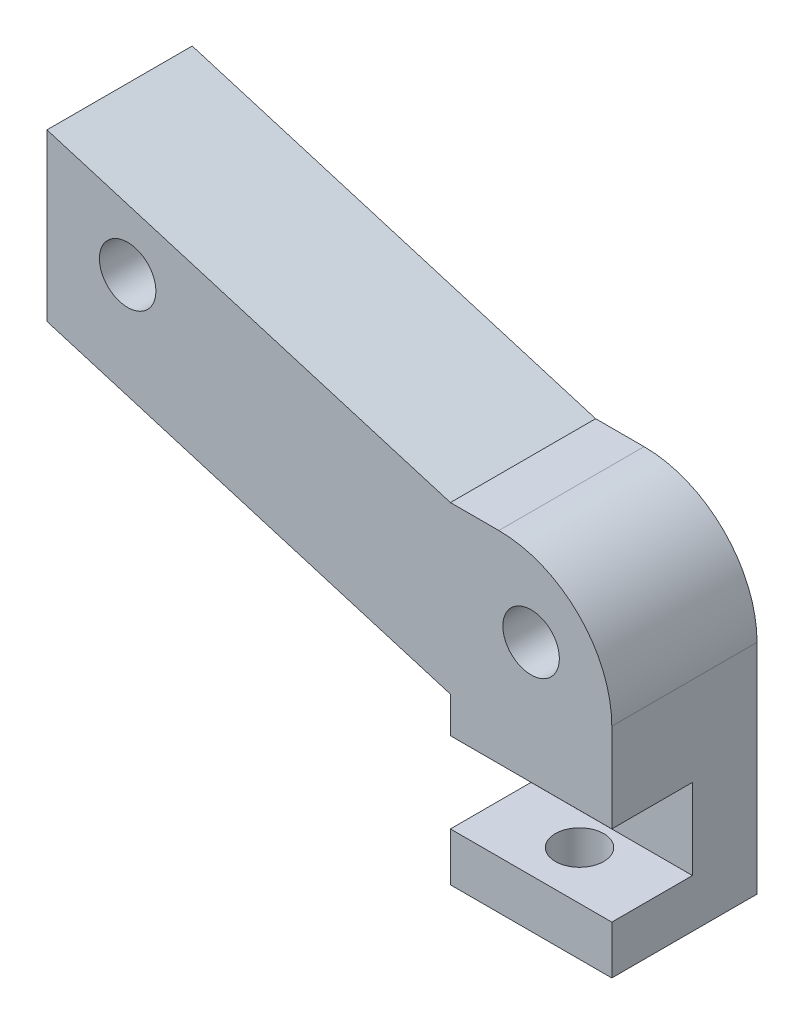
ISO-10303-21;
HEADER;
FILE_DESCRIPTION(('STEP AP214'),'2;1');
FILE_NAME('part.step','',(''),(''),'','','');
FILE_SCHEMA(('AUTOMOTIVE_DESIGN { 1 0 10303 214 1 1 1 1 }'));
ENDSEC;
DATA;
#1=APPLICATION_CONTEXT('core data for automotive mechanical design processes');
#2=APPLICATION_PROTOCOL_DEFINITION('international standard','automotive_design',2000,#1);
#3=PRODUCT_CONTEXT('',#1,'mechanical');
#4=PRODUCT('Part','Part','',(#3));
#5=PRODUCT_RELATED_PRODUCT_CATEGORY('part','',(#4));
#6=PRODUCT_DEFINITION_FORMATION('','',#4);
#7=PRODUCT_DEFINITION_CONTEXT('part definition',#1,'design');
#8=PRODUCT_DEFINITION('design','',#6,#7);
#9=PRODUCT_DEFINITION_SHAPE('','',#8);
#10=(LENGTH_UNIT() NAMED_UNIT(*) SI_UNIT(.MILLI.,.METRE.));
#11=(NAMED_UNIT(*) PLANE_ANGLE_UNIT() SI_UNIT($,.RADIAN.));
#12=(NAMED_UNIT(*) SI_UNIT($,.STERADIAN.) SOLID_ANGLE_UNIT());
#13=UNCERTAINTY_MEASURE_WITH_UNIT(LENGTH_MEASURE(1.E-05),#10,'distance_accuracy_value','');
#14=(GEOMETRIC_REPRESENTATION_CONTEXT(3) GLOBAL_UNCERTAINTY_ASSIGNED_CONTEXT((#13)) GLOBAL_UNIT_ASSIGNED_CONTEXT((#10,
#11,#12)) REPRESENTATION_CONTEXT('',''));
#15=CARTESIAN_POINT('',(0.,0.,0.));
#16=DIRECTION('',(0.,0.,1.));
#17=DIRECTION('',(1.,0.,0.));
#18=AXIS2_PLACEMENT_3D('',#15,#16,#17);
#19=CARTESIAN_POINT('',(0.,0.,9.));
#20=DIRECTION('',(0.,0.,1.));
#21=DIRECTION('',(1.,0.,0.));
#22=AXIS2_PLACEMENT_3D('',#19,#20,#21);
#23=PLANE('',#22);
#24=DIRECTION('',(0.,1.,0.));
#25=VECTOR('',#24,1.);
#26=CARTESIAN_POINT('',(19.1842031695687,-114.974376778641,9.));
#27=LINE('',#26,#25);
#28=CARTESIAN_POINT('',(19.1842031695687,-117.206503807883,9.));
#29=VERTEX_POINT('',#28);
#30=CARTESIAN_POINT('',(19.1842031695687,-111.693157960725,9.));
#31=VERTEX_POINT('',#30);
#32=EDGE_CURVE('E222',#29,#31,#27,.T.);
#33=ORIENTED_EDGE('',*,*,#32,.T.);
#34=CARTESIAN_POINT('',(12.1842031695687,-111.693157960725,9.));
#35=DIRECTION('',(0.,0.,1.));
#36=DIRECTION('',(1.,0.,0.));
#37=AXIS2_PLACEMENT_3D('',#34,#35,#36);
#38=CIRCLE('',#37,7.);
#39=CARTESIAN_POINT('',(12.1842031695687,-104.693157960725,9.));
#40=VERTEX_POINT('',#39);
#41=EDGE_CURVE('E11',#31,#40,#38,.T.);
#42=ORIENTED_EDGE('',*,*,#41,.T.);
#43=DIRECTION('',(-1.,0.,0.));
#44=VECTOR('',#43,1.);
#45=CARTESIAN_POINT('',(9.18420316956873,-104.693157960725,9.));
#46=LINE('',#45,#44);
#47=CARTESIAN_POINT('',(9.18420316956873,-104.693157960725,9.));
#48=VERTEX_POINT('',#47);
#49=EDGE_CURVE('E227',#40,#48,#46,.T.);
#50=ORIENTED_EDGE('',*,*,#49,.T.);
#51=DIRECTION('',(-0.957826285221151,0.287347885566348,0.));
#52=VECTOR('',#51,1.);
#53=CARTESIAN_POINT('',(-15.8157968304313,-97.1931579607244,9.));
#54=LINE('',#53,#52);
#55=CARTESIAN_POINT('',(-15.8157968304313,-97.1931579607244,9.));
#56=VERTEX_POINT('',#55);
#57=EDGE_CURVE('E204',#48,#56,#54,.T.);
#58=ORIENTED_EDGE('',*,*,#57,.T.);
#59=DIRECTION('',(0.,-1.,0.));
#60=VECTOR('',#59,1.);
#61=CARTESIAN_POINT('',(-15.8157968304313,-97.1931579607244,9.));
#62=LINE('',#61,#60);
#63=CARTESIAN_POINT('',(-15.8157968304313,-107.474376778641,9.));
#64=VERTEX_POINT('',#63);
#65=EDGE_CURVE('E208',#56,#64,#62,.T.);
#66=ORIENTED_EDGE('',*,*,#65,.T.);
#67=DIRECTION('',(0.957826285221151,-0.287347885566347,0.));
#68=VECTOR('',#67,1.);
#69=CARTESIAN_POINT('',(-15.8157968304313,-107.474376778641,9.));
#70=LINE('',#69,#68);
#71=CARTESIAN_POINT('',(9.18420316956873,-114.974376778641,9.));
#72=VERTEX_POINT('',#71);
#73=EDGE_CURVE('E212',#64,#72,#70,.T.);
#74=ORIENTED_EDGE('',*,*,#73,.T.);
#75=DIRECTION('',(0.,-1.,0.));
#76=VECTOR('',#75,1.);
#77=CARTESIAN_POINT('',(9.18420316956873,-114.974376778641,9.));
#78=LINE('',#77,#76);
#79=CARTESIAN_POINT('',(9.18420316956872,-117.206503807883,9.));
#80=VERTEX_POINT('',#79);
#81=EDGE_CURVE('E215',#72,#80,#78,.T.);
#82=ORIENTED_EDGE('',*,*,#81,.T.);
#83=DIRECTION('',(1.,0.,0.));
#84=VECTOR('',#83,1.);
#85=CARTESIAN_POINT('',(9.18420316956872,-117.206503807883,9.));
#86=LINE('',#85,#84);
#87=EDGE_CURVE('E169',#80,#29,#86,.T.);
#88=ORIENTED_EDGE('',*,*,#87,.T.);
#89=EDGE_LOOP('',(#33,#42,#50,#58,#66,#74,#82,#88));
#90=FACE_BOUND('',#89,.T.);
#91=CARTESIAN_POINT('',(14.1842031695687,-109.693157960725,9.));
#92=DIRECTION('',(0.,0.,1.));
#93=DIRECTION('',(1.,0.,0.));
#94=AXIS2_PLACEMENT_3D('',#91,#92,#93);
#95=CIRCLE('',#94,1.75);
#96=CARTESIAN_POINT('',(15.9342031695687,-109.693157960725,9.));
#97=VERTEX_POINT('',#96);
#98=EDGE_CURVE('E193',#97,#97,#95,.T.);
#99=ORIENTED_EDGE('',*,*,#98,.F.);
#100=EDGE_LOOP('',(#99));
#101=FACE_BOUND('',#100,.T.);
#102=CARTESIAN_POINT('',(-10.8157968304313,-102.474376778641,9.));
#103=DIRECTION('',(0.,0.,1.));
#104=DIRECTION('',(1.,0.,0.));
#105=AXIS2_PLACEMENT_3D('',#102,#103,#104);
#106=CIRCLE('',#105,1.75);
#107=CARTESIAN_POINT('',(-9.06579683043127,-102.474376778641,9.));
#108=VERTEX_POINT('',#107);
#109=EDGE_CURVE('E182',#108,#108,#106,.T.);
#110=ORIENTED_EDGE('',*,*,#109,.F.);
#111=EDGE_LOOP('',(#110));
#112=FACE_BOUND('',#111,.T.);
#113=ADVANCED_FACE('F39',(#90,#101,#112),#23,.T.);
#114=CARTESIAN_POINT('',(-15.8157968304313,-97.1931579607244,9.));
#115=DIRECTION('',(-0.287347885566348,-0.957826285221151,0.));
#116=DIRECTION('',(0.957826285221151,-0.287347885566348,0.));
#117=AXIS2_PLACEMENT_3D('',#114,#115,#116);
#118=PLANE('',#117);
#119=DIRECTION('',(-0.957826285221151,0.287347885566348,0.));
#120=VECTOR('',#119,1.);
#121=CARTESIAN_POINT('',(-15.8157968304313,-97.1931579607244,0.));
#122=LINE('',#121,#120);
#123=CARTESIAN_POINT('',(9.18420316956873,-104.693157960725,0.));
#124=VERTEX_POINT('',#123);
#125=CARTESIAN_POINT('',(-15.8157968304313,-97.1931579607244,0.));
#126=VERTEX_POINT('',#125);
#127=EDGE_CURVE('E192',#124,#126,#122,.T.);
#128=ORIENTED_EDGE('',*,*,#127,.T.);
#129=DIRECTION('',(0.,0.,-1.));
#130=VECTOR('',#129,1.);
#131=CARTESIAN_POINT('',(-15.8157968304313,-97.1931579607244,9.));
#132=LINE('',#131,#130);
#133=EDGE_CURVE('E271',#56,#126,#132,.T.);
#134=ORIENTED_EDGE('',*,*,#133,.F.);
#135=ORIENTED_EDGE('',*,*,#57,.F.);
#136=DIRECTION('',(0.,0.,-1.));
#137=VECTOR('',#136,1.);
#138=CARTESIAN_POINT('',(9.18420316956873,-104.693157960725,9.));
#139=LINE('',#138,#137);
#140=EDGE_CURVE('E230',#48,#124,#139,.T.);
#141=ORIENTED_EDGE('',*,*,#140,.T.);
#142=EDGE_LOOP('',(#128,#134,#135,#141));
#143=FACE_BOUND('',#142,.T.);
#144=ADVANCED_FACE('F322',(#143),#118,.F.);
#145=CARTESIAN_POINT('',(-15.8157968304313,-97.1931579607244,9.));
#146=DIRECTION('',(1.,0.,0.));
#147=DIRECTION('',(0.,1.,0.));
#148=AXIS2_PLACEMENT_3D('',#145,#146,#147);
#149=PLANE('',#148);
#150=DIRECTION('',(0.,-1.,0.));
#151=VECTOR('',#150,1.);
#152=CARTESIAN_POINT('',(-15.8157968304313,-97.1931579607244,0.));
#153=LINE('',#152,#151);
#154=CARTESIAN_POINT('',(-15.8157968304313,-107.474376778641,0.));
#155=VERTEX_POINT('',#154);
#156=EDGE_CURVE('E234',#126,#155,#153,.T.);
#157=ORIENTED_EDGE('',*,*,#156,.T.);
#158=DIRECTION('',(0.,0.,-1.));
#159=VECTOR('',#158,1.);
#160=CARTESIAN_POINT('',(-15.8157968304313,-107.474376778641,9.));
#161=LINE('',#160,#159);
#162=EDGE_CURVE('E267',#64,#155,#161,.T.);
#163=ORIENTED_EDGE('',*,*,#162,.F.);
#164=ORIENTED_EDGE('',*,*,#65,.F.);
#165=ORIENTED_EDGE('',*,*,#133,.T.);
#166=EDGE_LOOP('',(#157,#163,#164,#165));
#167=FACE_BOUND('',#166,.T.);
#168=ADVANCED_FACE('F325',(#167),#149,.F.);
#169=CARTESIAN_POINT('',(-15.8157968304313,-107.474376778641,9.));
#170=DIRECTION('',(0.287347885566347,0.957826285221151,0.));
#171=DIRECTION('',(-0.957826285221151,0.287347885566347,0.));
#172=AXIS2_PLACEMENT_3D('',#169,#170,#171);
#173=PLANE('',#172);
#174=DIRECTION('',(0.957826285221151,-0.287347885566347,0.));
#175=VECTOR('',#174,1.);
#176=CARTESIAN_POINT('',(-15.8157968304313,-107.474376778641,0.));
#177=LINE('',#176,#175);
#178=CARTESIAN_POINT('',(9.18420316956873,-114.974376778641,0.));
#179=VERTEX_POINT('',#178);
#180=EDGE_CURVE('E237',#155,#179,#177,.T.);
#181=ORIENTED_EDGE('',*,*,#180,.T.);
#182=DIRECTION('',(0.,0.,-1.));
#183=VECTOR('',#182,1.);
#184=CARTESIAN_POINT('',(9.18420316956873,-114.974376778641,9.));
#185=LINE('',#184,#183);
#186=EDGE_CURVE('E263',#72,#179,#185,.T.);
#187=ORIENTED_EDGE('',*,*,#186,.F.);
#188=ORIENTED_EDGE('',*,*,#73,.F.);
#189=ORIENTED_EDGE('',*,*,#162,.T.);
#190=EDGE_LOOP('',(#181,#187,#188,#189));
#191=FACE_BOUND('',#190,.T.);
#192=ADVANCED_FACE('F326',(#191),#173,.F.);
#193=CARTESIAN_POINT('',(9.18420316956873,-114.974376778641,9.));
#194=DIRECTION('',(1.,0.,0.));
#195=DIRECTION('',(0.,0.,-1.));
#196=AXIS2_PLACEMENT_3D('',#193,#194,#195);
#197=PLANE('',#196);
#198=DIRECTION('',(0.,1.,0.));
#199=VECTOR('',#198,1.);
#200=CARTESIAN_POINT('',(9.18420316956872,-122.206503807883,4.00381311173703));
#201=LINE('',#200,#199);
#202=CARTESIAN_POINT('',(9.18420316956872,-122.206503807883,4.00381311173703));
#203=VERTEX_POINT('',#202);
#204=CARTESIAN_POINT('',(9.18420316956872,-117.206503807883,4.00381311173703));
#205=VERTEX_POINT('',#204);
#206=EDGE_CURVE('E144',#203,#205,#201,.T.);
#207=ORIENTED_EDGE('',*,*,#206,.T.);
#208=DIRECTION('',(0.,0.,1.));
#209=VECTOR('',#208,1.);
#210=CARTESIAN_POINT('',(9.18420316956872,-117.206503807883,9.));
#211=LINE('',#210,#209);
#212=EDGE_CURVE('E150',#205,#80,#211,.T.);
#213=ORIENTED_EDGE('',*,*,#212,.T.);
#214=ORIENTED_EDGE('',*,*,#81,.F.);
#215=ORIENTED_EDGE('',*,*,#186,.T.);
#216=DIRECTION('',(0.,-1.,0.));
#217=VECTOR('',#216,1.);
#218=CARTESIAN_POINT('',(9.18420316956873,-114.974376778641,0.));
#219=LINE('',#218,#217);
#220=CARTESIAN_POINT('',(9.18420316956873,-125.206503807883,0.));
#221=VERTEX_POINT('',#220);
#222=EDGE_CURVE('E240',#179,#221,#219,.T.);
#223=ORIENTED_EDGE('',*,*,#222,.T.);
#224=DIRECTION('',(0.,0.,-1.));
#225=VECTOR('',#224,1.);
#226=CARTESIAN_POINT('',(9.18420316956873,-125.206503807883,9.));
#227=LINE('',#226,#225);
#228=CARTESIAN_POINT('',(9.18420316956873,-125.206503807883,9.));
#229=VERTEX_POINT('',#228);
#230=EDGE_CURVE('E259',#229,#221,#227,.T.);
#231=ORIENTED_EDGE('',*,*,#230,.F.);
#232=CARTESIAN_POINT('',(9.18420316956873,-122.206503807883,9.));
#233=VERTEX_POINT('',#232);
#234=EDGE_CURVE('E155',#233,#229,#78,.T.);
#235=ORIENTED_EDGE('',*,*,#234,.F.);
#236=DIRECTION('',(0.,0.,-1.));
#237=VECTOR('',#236,1.);
#238=CARTESIAN_POINT('',(9.18420316956872,-122.206503807883,9.));
#239=LINE('',#238,#237);
#240=EDGE_CURVE('E132',#233,#203,#239,.T.);
#241=ORIENTED_EDGE('',*,*,#240,.T.);
#242=EDGE_LOOP('',(#207,#213,#214,#215,#223,#231,#235,#241));
#243=FACE_BOUND('',#242,.T.);
#244=ADVANCED_FACE('F153',(#243),#197,.F.);
#245=CARTESIAN_POINT('',(19.1842031695687,-125.206503807883,9.));
#246=DIRECTION('',(0.,1.,0.));
#247=DIRECTION('',(0.,0.,1.));
#248=AXIS2_PLACEMENT_3D('',#245,#246,#247);
#249=PLANE('',#248);
#250=CARTESIAN_POINT('',(14.1842031695687,-125.206503807883,6.));
#251=DIRECTION('',(0.,-1.,0.));
#252=DIRECTION('',(0.,0.,-1.));
#253=AXIS2_PLACEMENT_3D('',#250,#251,#252);
#254=CIRCLE('',#253,1.5);
#255=CARTESIAN_POINT('',(14.1842031695687,-125.206503807883,4.5));
#256=VERTEX_POINT('',#255);
#257=EDGE_CURVE('E183',#256,#256,#254,.T.);
#258=ORIENTED_EDGE('',*,*,#257,.F.);
#259=EDGE_LOOP('',(#258));
#260=FACE_BOUND('',#259,.T.);
#261=DIRECTION('',(1.,0.,0.));
#262=VECTOR('',#261,1.);
#263=CARTESIAN_POINT('',(19.1842031695687,-125.206503807883,0.));
#264=LINE('',#263,#262);
#265=CARTESIAN_POINT('',(19.1842031695687,-125.206503807883,0.));
#266=VERTEX_POINT('',#265);
#267=EDGE_CURVE('E243',#221,#266,#264,.T.);
#268=ORIENTED_EDGE('',*,*,#267,.T.);
#269=DIRECTION('',(0.,0.,-1.));
#270=VECTOR('',#269,1.);
#271=CARTESIAN_POINT('',(19.1842031695687,-125.206503807883,9.));
#272=LINE('',#271,#270);
#273=CARTESIAN_POINT('',(19.1842031695687,-125.206503807883,9.));
#274=VERTEX_POINT('',#273);
#275=EDGE_CURVE('E255',#274,#266,#272,.T.);
#276=ORIENTED_EDGE('',*,*,#275,.F.);
#277=DIRECTION('',(1.,0.,0.));
#278=VECTOR('',#277,1.);
#279=CARTESIAN_POINT('',(19.1842031695687,-125.206503807883,9.));
#280=LINE('',#279,#278);
#281=EDGE_CURVE('E219',#229,#274,#280,.T.);
#282=ORIENTED_EDGE('',*,*,#281,.F.);
#283=ORIENTED_EDGE('',*,*,#230,.T.);
#284=EDGE_LOOP('',(#268,#276,#282,#283));
#285=FACE_BOUND('',#284,.T.);
#286=ADVANCED_FACE('F296',(#260,#285),#249,.F.);
#287=CARTESIAN_POINT('',(19.1842031695687,-114.974376778641,9.));
#288=DIRECTION('',(-1.,0.,0.));
#289=DIRECTION('',(0.,0.,1.));
#290=AXIS2_PLACEMENT_3D('',#287,#288,#289);
#291=PLANE('',#290);
#292=DIRECTION('',(0.,1.,0.));
#293=VECTOR('',#292,1.);
#294=CARTESIAN_POINT('',(19.1842031695687,-114.974376778641,0.));
#295=LINE('',#294,#293);
#296=CARTESIAN_POINT('',(19.1842031695687,-111.693157960725,0.));
#297=VERTEX_POINT('',#296);
#298=EDGE_CURVE('E247',#266,#297,#295,.T.);
#299=ORIENTED_EDGE('',*,*,#298,.T.);
#300=DIRECTION('',(0.,0.,-1.));
#301=VECTOR('',#300,1.);
#302=CARTESIAN_POINT('',(19.1842031695687,-111.693157960725,9.));
#303=LINE('',#302,#301);
#304=EDGE_CURVE('E48',#297,#31,#303,.F.);
#305=ORIENTED_EDGE('',*,*,#304,.T.);
#306=ORIENTED_EDGE('',*,*,#32,.F.);
#307=DIRECTION('',(0.,0.,1.));
#308=VECTOR('',#307,1.);
#309=CARTESIAN_POINT('',(19.1842031695687,-117.206503807883,9.));
#310=LINE('',#309,#308);
#311=CARTESIAN_POINT('',(19.1842031695687,-117.206503807883,4.00381311173703));
#312=VERTEX_POINT('',#311);
#313=EDGE_CURVE('E157',#312,#29,#310,.T.);
#314=ORIENTED_EDGE('',*,*,#313,.F.);
#315=DIRECTION('',(0.,1.,0.));
#316=VECTOR('',#315,1.);
#317=CARTESIAN_POINT('',(19.1842031695687,-122.206503807883,4.00381311173703));
#318=LINE('',#317,#316);
#319=CARTESIAN_POINT('',(19.1842031695687,-122.206503807883,4.00381311173703));
#320=VERTEX_POINT('',#319);
#321=EDGE_CURVE('E160',#320,#312,#318,.T.);
#322=ORIENTED_EDGE('',*,*,#321,.F.);
#323=DIRECTION('',(0.,0.,-1.));
#324=VECTOR('',#323,1.);
#325=CARTESIAN_POINT('',(19.1842031695687,-122.206503807883,9.));
#326=LINE('',#325,#324);
#327=CARTESIAN_POINT('',(19.1842031695687,-122.206503807883,9.));
#328=VERTEX_POINT('',#327);
#329=EDGE_CURVE('E135',#328,#320,#326,.T.);
#330=ORIENTED_EDGE('',*,*,#329,.F.);
#331=EDGE_CURVE('E223',#274,#328,#27,.T.);
#332=ORIENTED_EDGE('',*,*,#331,.F.);
#333=ORIENTED_EDGE('',*,*,#275,.T.);
#334=EDGE_LOOP('',(#299,#305,#306,#314,#322,#330,#332,#333));
#335=FACE_BOUND('',#334,.T.);
#336=ADVANCED_FACE('F298',(#335),#291,.F.);
#337=CARTESIAN_POINT('',(9.18420316956873,-104.693157960725,9.));
#338=DIRECTION('',(0.,-1.,0.));
#339=DIRECTION('',(0.,0.,-1.));
#340=AXIS2_PLACEMENT_3D('',#337,#338,#339);
#341=PLANE('',#340);
#342=ORIENTED_EDGE('',*,*,#49,.F.);
#343=DIRECTION('',(0.,0.,-1.));
#344=VECTOR('',#343,1.);
#345=CARTESIAN_POINT('',(12.1842031695687,-104.693157960725,9.));
#346=LINE('',#345,#344);
#347=CARTESIAN_POINT('',(12.1842031695687,-104.693157960725,0.));
#348=VERTEX_POINT('',#347);
#349=EDGE_CURVE('E275',#40,#348,#346,.T.);
#350=ORIENTED_EDGE('',*,*,#349,.T.);
#351=DIRECTION('',(-1.,0.,0.));
#352=VECTOR('',#351,1.);
#353=CARTESIAN_POINT('',(9.18420316956873,-104.693157960725,0.));
#354=LINE('',#353,#352);
#355=EDGE_CURVE('E209',#348,#124,#354,.T.);
#356=ORIENTED_EDGE('',*,*,#355,.T.);
#357=ORIENTED_EDGE('',*,*,#140,.F.);
#358=EDGE_LOOP('',(#342,#350,#356,#357));
#359=FACE_BOUND('',#358,.T.);
#360=ADVANCED_FACE('F317',(#359),#341,.F.);
#361=DIRECTION('',(1.,0.,0.));
#362=VECTOR('',#361,1.);
#363=CARTESIAN_POINT('',(9.18420316956872,-122.206503807883,9.));
#364=LINE('',#363,#362);
#365=EDGE_CURVE('E141',#233,#328,#364,.T.);
#366=ORIENTED_EDGE('',*,*,#365,.F.);
#367=ORIENTED_EDGE('',*,*,#234,.T.);
#368=ORIENTED_EDGE('',*,*,#281,.T.);
#369=ORIENTED_EDGE('',*,*,#331,.T.);
#370=EDGE_LOOP('',(#366,#367,#368,#369));
#371=FACE_BOUND('',#370,.T.);
#372=ADVANCED_FACE('F290',(#371),#23,.T.);
#373=CARTESIAN_POINT('',(0.,0.,0.));
#374=DIRECTION('',(0.,0.,1.));
#375=DIRECTION('',(1.,0.,0.));
#376=AXIS2_PLACEMENT_3D('',#373,#374,#375);
#377=PLANE('',#376);
#378=CARTESIAN_POINT('',(14.1842031695687,-109.693157960725,0.));
#379=DIRECTION('',(0.,0.,1.));
#380=DIRECTION('',(1.,0.,0.));
#381=AXIS2_PLACEMENT_3D('',#378,#379,#380);
#382=CIRCLE('',#381,1.75);
#383=CARTESIAN_POINT('',(15.9342031695687,-109.693157960725,0.));
#384=VERTEX_POINT('',#383);
#385=EDGE_CURVE('E188',#384,#384,#382,.T.);
#386=ORIENTED_EDGE('',*,*,#385,.T.);
#387=EDGE_LOOP('',(#386));
#388=FACE_BOUND('',#387,.T.);
#389=CARTESIAN_POINT('',(-10.8157968304313,-102.474376778641,0.));
#390=DIRECTION('',(0.,0.,1.));
#391=DIRECTION('',(1.,0.,0.));
#392=AXIS2_PLACEMENT_3D('',#389,#390,#391);
#393=CIRCLE('',#392,1.75);
#394=CARTESIAN_POINT('',(-9.06579683043127,-102.474376778641,0.));
#395=VERTEX_POINT('',#394);
#396=EDGE_CURVE('E197',#395,#395,#393,.T.);
#397=ORIENTED_EDGE('',*,*,#396,.T.);
#398=EDGE_LOOP('',(#397));
#399=FACE_BOUND('',#398,.T.);
#400=ORIENTED_EDGE('',*,*,#355,.F.);
#401=CARTESIAN_POINT('',(12.1842031695687,-111.693157960725,0.));
#402=DIRECTION('',(0.,0.,1.));
#403=DIRECTION('',(1.,0.,0.));
#404=AXIS2_PLACEMENT_3D('',#401,#402,#403);
#405=CIRCLE('',#404,7.);
#406=EDGE_CURVE('E62',#348,#297,#405,.F.);
#407=ORIENTED_EDGE('',*,*,#406,.T.);
#408=ORIENTED_EDGE('',*,*,#298,.F.);
#409=ORIENTED_EDGE('',*,*,#267,.F.);
#410=ORIENTED_EDGE('',*,*,#222,.F.);
#411=ORIENTED_EDGE('',*,*,#180,.F.);
#412=ORIENTED_EDGE('',*,*,#156,.F.);
#413=ORIENTED_EDGE('',*,*,#127,.F.);
#414=EDGE_LOOP('',(#400,#407,#408,#409,#410,#411,#412,#413));
#415=FACE_BOUND('',#414,.T.);
#416=ADVANCED_FACE('F311',(#388,#399,#415),#377,.F.);
#417=CARTESIAN_POINT('',(-10.8157968304313,-102.474376778641,0.));
#418=DIRECTION('',(0.,0.,1.));
#419=DIRECTION('',(1.,0.,0.));
#420=AXIS2_PLACEMENT_3D('',#417,#418,#419);
#421=CYLINDRICAL_SURFACE('',#420,1.75);
#422=ORIENTED_EDGE('',*,*,#396,.F.);
#423=EDGE_LOOP('',(#422));
#424=FACE_BOUND('',#423,.T.);
#425=ORIENTED_EDGE('',*,*,#109,.T.);
#426=EDGE_LOOP('',(#425));
#427=FACE_BOUND('',#426,.T.);
#428=ADVANCED_FACE('F350',(#424,#427),#421,.F.);
#429=CARTESIAN_POINT('',(14.1842031695687,-109.693157960725,0.));
#430=DIRECTION('',(0.,0.,1.));
#431=DIRECTION('',(1.,0.,0.));
#432=AXIS2_PLACEMENT_3D('',#429,#430,#431);
#433=CYLINDRICAL_SURFACE('',#432,1.75);
#434=ORIENTED_EDGE('',*,*,#385,.F.);
#435=EDGE_LOOP('',(#434));
#436=FACE_BOUND('',#435,.T.);
#437=ORIENTED_EDGE('',*,*,#98,.T.);
#438=EDGE_LOOP('',(#437));
#439=FACE_BOUND('',#438,.T.);
#440=ADVANCED_FACE('F366',(#436,#439),#433,.F.);
#441=CARTESIAN_POINT('',(14.1842031695687,-115.206503807883,6.));
#442=DIRECTION('',(0.,-1.,0.));
#443=DIRECTION('',(0.,0.,-1.));
#444=AXIS2_PLACEMENT_3D('',#441,#442,#443);
#445=CYLINDRICAL_SURFACE('',#444,1.5);
#446=CARTESIAN_POINT('',(14.1842031695687,-122.206503807883,6.));
#447=DIRECTION('',(0.,-1.,0.));
#448=DIRECTION('',(0.,0.,-1.));
#449=AXIS2_PLACEMENT_3D('',#446,#447,#448);
#450=CIRCLE('',#449,1.5);
#451=CARTESIAN_POINT('',(14.1842031695687,-122.206503807883,4.5));
#452=VERTEX_POINT('',#451);
#453=EDGE_CURVE('E173',#452,#452,#450,.F.);
#454=ORIENTED_EDGE('',*,*,#453,.T.);
#455=EDGE_LOOP('',(#454));
#456=FACE_BOUND('',#455,.T.);
#457=ORIENTED_EDGE('',*,*,#257,.T.);
#458=EDGE_LOOP('',(#457));
#459=FACE_BOUND('',#458,.T.);
#460=ADVANCED_FACE('F364',(#456,#459),#445,.F.);
#461=CARTESIAN_POINT('',(9.18420316956872,-117.206503807883,9.));
#462=DIRECTION('',(0.,1.,0.));
#463=DIRECTION('',(0.,0.,1.));
#464=AXIS2_PLACEMENT_3D('',#461,#462,#463);
#465=PLANE('',#464);
#466=ORIENTED_EDGE('',*,*,#313,.T.);
#467=ORIENTED_EDGE('',*,*,#87,.F.);
#468=ORIENTED_EDGE('',*,*,#212,.F.);
#469=DIRECTION('',(1.,0.,0.));
#470=VECTOR('',#469,1.);
#471=CARTESIAN_POINT('',(9.18420316956872,-117.206503807883,4.00381311173703));
#472=LINE('',#471,#470);
#473=EDGE_CURVE('E140',#205,#312,#472,.T.);
#474=ORIENTED_EDGE('',*,*,#473,.T.);
#475=EDGE_LOOP('',(#466,#467,#468,#474));
#476=FACE_BOUND('',#475,.T.);
#477=CARTESIAN_POINT('',(14.1842031695687,-117.206503807883,6.));
#478=DIRECTION('',(0.,1.,0.));
#479=DIRECTION('',(0.,0.,1.));
#480=AXIS2_PLACEMENT_3D('',#477,#478,#479);
#481=CIRCLE('',#480,1.5);
#482=CARTESIAN_POINT('',(14.1842031695687,-117.206503807883,7.5));
#483=VERTEX_POINT('',#482);
#484=EDGE_CURVE('E187',#483,#483,#481,.F.);
#485=ORIENTED_EDGE('',*,*,#484,.F.);
#486=EDGE_LOOP('',(#485));
#487=FACE_BOUND('',#486,.T.);
#488=ADVANCED_FACE('F301',(#476,#487),#465,.F.);
#489=CARTESIAN_POINT('',(9.18420316956872,-122.206503807883,9.));
#490=DIRECTION('',(0.,-1.,0.));
#491=DIRECTION('',(0.,0.,-1.));
#492=AXIS2_PLACEMENT_3D('',#489,#490,#491);
#493=PLANE('',#492);
#494=ORIENTED_EDGE('',*,*,#329,.T.);
#495=DIRECTION('',(1.,0.,0.));
#496=VECTOR('',#495,1.);
#497=CARTESIAN_POINT('',(9.18420316956872,-122.206503807883,4.00381311173703));
#498=LINE('',#497,#496);
#499=EDGE_CURVE('E127',#203,#320,#498,.T.);
#500=ORIENTED_EDGE('',*,*,#499,.F.);
#501=ORIENTED_EDGE('',*,*,#240,.F.);
#502=ORIENTED_EDGE('',*,*,#365,.T.);
#503=EDGE_LOOP('',(#494,#500,#501,#502));
#504=FACE_BOUND('',#503,.T.);
#505=ORIENTED_EDGE('',*,*,#453,.F.);
#506=EDGE_LOOP('',(#505));
#507=FACE_BOUND('',#506,.T.);
#508=ADVANCED_FACE('F129',(#504,#507),#493,.F.);
#509=CARTESIAN_POINT('',(9.18420316956872,-122.206503807883,4.00381311173703));
#510=DIRECTION('',(0.,0.,-1.));
#511=DIRECTION('',(-1.,0.,0.));
#512=AXIS2_PLACEMENT_3D('',#509,#510,#511);
#513=PLANE('',#512);
#514=ORIENTED_EDGE('',*,*,#321,.T.);
#515=ORIENTED_EDGE('',*,*,#473,.F.);
#516=ORIENTED_EDGE('',*,*,#206,.F.);
#517=ORIENTED_EDGE('',*,*,#499,.T.);
#518=EDGE_LOOP('',(#514,#515,#516,#517));
#519=FACE_BOUND('',#518,.T.);
#520=ADVANCED_FACE('F145',(#519),#513,.F.);
#521=CARTESIAN_POINT('',(14.1842031695687,-115.206503807883,6.));
#522=DIRECTION('',(0.,-1.,0.));
#523=DIRECTION('',(0.,0.,-1.));
#524=AXIS2_PLACEMENT_3D('',#521,#522,#523);
#525=PLANE('',#524);
#526=CARTESIAN_POINT('',(14.1842031695687,-115.206503807883,6.));
#527=DIRECTION('',(0.,-1.,0.));
#528=DIRECTION('',(0.,0.,-1.));
#529=AXIS2_PLACEMENT_3D('',#526,#527,#528);
#530=CIRCLE('',#529,1.5);
#531=CARTESIAN_POINT('',(14.1842031695687,-115.206503807883,4.5));
#532=VERTEX_POINT('',#531);
#533=EDGE_CURVE('E178',#532,#532,#530,.T.);
#534=ORIENTED_EDGE('',*,*,#533,.T.);
#535=EDGE_LOOP('',(#534));
#536=FACE_BOUND('',#535,.T.);
#537=ADVANCED_FACE('F379',(#536),#525,.T.);
#538=ORIENTED_EDGE('',*,*,#484,.T.);
#539=EDGE_LOOP('',(#538));
#540=FACE_BOUND('',#539,.T.);
#541=ORIENTED_EDGE('',*,*,#533,.F.);
#542=EDGE_LOOP('',(#541));
#543=FACE_BOUND('',#542,.T.);
#544=ADVANCED_FACE('F369',(#540,#543),#445,.F.);
#545=CARTESIAN_POINT('',(12.1842031695687,-111.693157960725,9.));
#546=DIRECTION('',(0.,0.,-1.));
#547=DIRECTION('',(-1.,0.,0.));
#548=AXIS2_PLACEMENT_3D('',#545,#546,#547);
#549=CYLINDRICAL_SURFACE('',#548,7.);
#550=ORIENTED_EDGE('',*,*,#41,.F.);
#551=ORIENTED_EDGE('',*,*,#304,.F.);
#552=ORIENTED_EDGE('',*,*,#406,.F.);
#553=ORIENTED_EDGE('',*,*,#349,.F.);
#554=EDGE_LOOP('',(#550,#551,#552,#553));
#555=FACE_BOUND('',#554,.T.);
#556=ADVANCED_FACE('F41',(#555),#549,.T.);
#557=CLOSED_SHELL('',(#113,#144,#168,#192,#244,#286,#336,#360,#372,#416,#428,#440,#460,#488,
#508,#520,#537,#544,#556));
#558=MANIFOLD_SOLID_BREP('B2',#557);
#559=ADVANCED_BREP_SHAPE_REPRESENTATION('',(#18,#558),#14);
#560=SHAPE_DEFINITION_REPRESENTATION(#9,#559);
ENDSEC;
END-ISO-10303-21;
